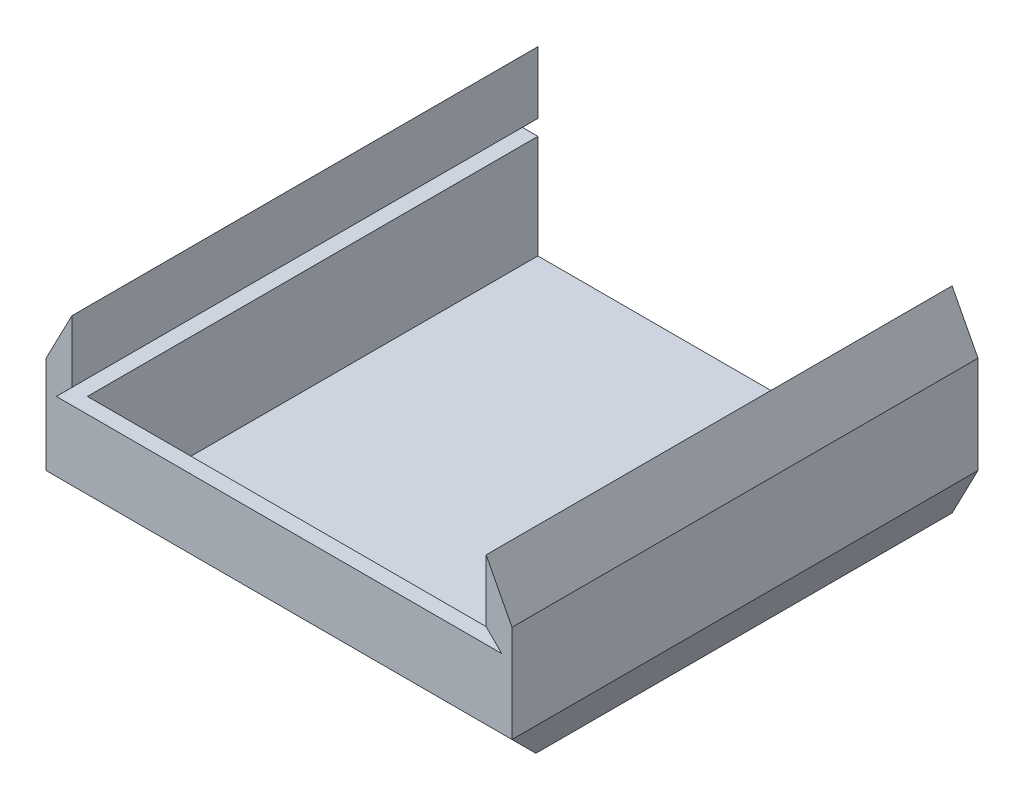
ISO-10303-21;
HEADER;
FILE_DESCRIPTION(('STEP AP214'),'2;1');
FILE_NAME('part.step','',(''),(''),'','','');
FILE_SCHEMA(('AUTOMOTIVE_DESIGN { 1 0 10303 214 1 1 1 1 }'));
ENDSEC;
DATA;
#1=APPLICATION_CONTEXT('core data for automotive mechanical design processes');
#2=APPLICATION_PROTOCOL_DEFINITION('international standard','automotive_design',2000,#1);
#3=PRODUCT_CONTEXT('',#1,'mechanical');
#4=PRODUCT('Part','Part','',(#3));
#5=PRODUCT_RELATED_PRODUCT_CATEGORY('part','',(#4));
#6=PRODUCT_DEFINITION_FORMATION('','',#4);
#7=PRODUCT_DEFINITION_CONTEXT('part definition',#1,'design');
#8=PRODUCT_DEFINITION('design','',#6,#7);
#9=PRODUCT_DEFINITION_SHAPE('','',#8);
#10=(LENGTH_UNIT() NAMED_UNIT(*) SI_UNIT(.MILLI.,.METRE.));
#11=(NAMED_UNIT(*) PLANE_ANGLE_UNIT() SI_UNIT($,.RADIAN.));
#12=(NAMED_UNIT(*) SI_UNIT($,.STERADIAN.) SOLID_ANGLE_UNIT());
#13=UNCERTAINTY_MEASURE_WITH_UNIT(LENGTH_MEASURE(1.E-05),#10,'distance_accuracy_value','');
#14=(GEOMETRIC_REPRESENTATION_CONTEXT(3) GLOBAL_UNCERTAINTY_ASSIGNED_CONTEXT((#13)) GLOBAL_UNIT_ASSIGNED_CONTEXT((#10,
#11,#12)) REPRESENTATION_CONTEXT('',''));
#15=CARTESIAN_POINT('',(0.,0.,0.));
#16=DIRECTION('',(0.,0.,1.));
#17=DIRECTION('',(1.,0.,0.));
#18=AXIS2_PLACEMENT_3D('',#15,#16,#17);
#19=CARTESIAN_POINT('',(0.,38.,-90.));
#20=DIRECTION('',(1.,0.,0.));
#21=DIRECTION('',(0.,1.,0.));
#22=AXIS2_PLACEMENT_3D('',#19,#20,#21);
#23=PLANE('',#22);
#24=DIRECTION('',(0.,-1.,0.));
#25=VECTOR('',#24,1.);
#26=CARTESIAN_POINT('',(0.,23.,-3.));
#27=LINE('',#26,#25);
#28=CARTESIAN_POINT('',(0.,23.,-3.00000000000003));
#29=VERTEX_POINT('',#28);
#30=CARTESIAN_POINT('',(0.,7.99999999999998,-3.));
#31=VERTEX_POINT('',#30);
#32=EDGE_CURVE('E324',#29,#31,#27,.T.);
#33=ORIENTED_EDGE('',*,*,#32,.T.);
#34=DIRECTION('',(0.,0.707106781186545,0.70710678118655));
#35=VECTOR('',#34,1.);
#36=CARTESIAN_POINT('',(0.,-20.5000000000001,-31.5000000000003));
#37=LINE('',#36,#35);
#38=CARTESIAN_POINT('',(0.,3.,-8.00000000000001));
#39=VERTEX_POINT('',#38);
#40=EDGE_CURVE('E11',#31,#39,#37,.F.);
#41=ORIENTED_EDGE('',*,*,#40,.T.);
#42=DIRECTION('',(0.,0.,1.));
#43=VECTOR('',#42,1.);
#44=CARTESIAN_POINT('',(0.,3.,0.));
#45=LINE('',#44,#43);
#46=CARTESIAN_POINT('',(0.,3.,-90.));
#47=VERTEX_POINT('',#46);
#48=EDGE_CURVE('E179',#47,#39,#45,.T.);
#49=ORIENTED_EDGE('',*,*,#48,.F.);
#50=DIRECTION('',(0.,1.,0.));
#51=VECTOR('',#50,1.);
#52=CARTESIAN_POINT('',(0.,38.,-90.));
#53=LINE('',#52,#51);
#54=CARTESIAN_POINT('',(0.,23.,-90.));
#55=VERTEX_POINT('',#54);
#56=EDGE_CURVE('E173',#47,#55,#53,.T.);
#57=ORIENTED_EDGE('',*,*,#56,.T.);
#58=DIRECTION('',(0.,0.,1.));
#59=VECTOR('',#58,1.);
#60=CARTESIAN_POINT('',(0.,23.,-90.));
#61=LINE('',#60,#59);
#62=EDGE_CURVE('E156',#55,#29,#61,.T.);
#63=ORIENTED_EDGE('',*,*,#62,.T.);
#64=EDGE_LOOP('',(#33,#41,#49,#57,#63));
#65=FACE_BOUND('',#64,.T.);
#66=ADVANCED_FACE('F32',(#65),#23,.T.);
#67=CARTESIAN_POINT('',(0.,3.,0.));
#68=DIRECTION('',(0.,-1.,0.));
#69=DIRECTION('',(0.,0.,-1.));
#70=AXIS2_PLACEMENT_3D('',#67,#68,#69);
#71=PLANE('',#70);
#72=ORIENTED_EDGE('',*,*,#48,.T.);
#73=DIRECTION('',(1.,0.,0.));
#74=VECTOR('',#73,1.);
#75=CARTESIAN_POINT('',(80.,3.,-8.00000000000002));
#76=LINE('',#75,#74);
#77=CARTESIAN_POINT('',(80.,3.,-8.00000000000001));
#78=VERTEX_POINT('',#77);
#79=EDGE_CURVE('E235',#39,#78,#76,.T.);
#80=ORIENTED_EDGE('',*,*,#79,.T.);
#81=DIRECTION('',(0.,0.,-1.));
#82=VECTOR('',#81,1.);
#83=CARTESIAN_POINT('',(80.,3.,0.));
#84=LINE('',#83,#82);
#85=CARTESIAN_POINT('',(80.,3.,-90.));
#86=VERTEX_POINT('',#85);
#87=EDGE_CURVE('E211',#78,#86,#84,.T.);
#88=ORIENTED_EDGE('',*,*,#87,.T.);
#89=DIRECTION('',(-1.,0.,0.));
#90=VECTOR('',#89,1.);
#91=CARTESIAN_POINT('',(0.,3.,-90.));
#92=LINE('',#91,#90);
#93=EDGE_CURVE('E214',#86,#47,#92,.T.);
#94=ORIENTED_EDGE('',*,*,#93,.T.);
#95=EDGE_LOOP('',(#72,#80,#88,#94));
#96=FACE_BOUND('',#95,.T.);
#97=ADVANCED_FACE('F240',(#96),#71,.F.);
#98=CARTESIAN_POINT('',(80.,38.,-90.));
#99=DIRECTION('',(-1.,0.,0.));
#100=DIRECTION('',(0.,-1.,0.));
#101=AXIS2_PLACEMENT_3D('',#98,#99,#100);
#102=PLANE('',#101);
#103=ORIENTED_EDGE('',*,*,#87,.F.);
#104=DIRECTION('',(0.,-0.707106781186545,-0.70710678118655));
#105=VECTOR('',#104,1.);
#106=CARTESIAN_POINT('',(80.,-20.5000000000001,-31.5000000000004));
#107=LINE('',#106,#105);
#108=CARTESIAN_POINT('',(80.,7.99999999999998,-3.));
#109=VERTEX_POINT('',#108);
#110=EDGE_CURVE('E54',#78,#109,#107,.F.);
#111=ORIENTED_EDGE('',*,*,#110,.T.);
#112=DIRECTION('',(0.,1.,0.));
#113=VECTOR('',#112,1.);
#114=CARTESIAN_POINT('',(80.,23.,-3.));
#115=LINE('',#114,#113);
#116=CARTESIAN_POINT('',(80.,23.,-3.00000000000003));
#117=VERTEX_POINT('',#116);
#118=EDGE_CURVE('E322',#109,#117,#115,.T.);
#119=ORIENTED_EDGE('',*,*,#118,.T.);
#120=DIRECTION('',(0.,0.,1.));
#121=VECTOR('',#120,1.);
#122=CARTESIAN_POINT('',(80.,23.,-90.));
#123=LINE('',#122,#121);
#124=CARTESIAN_POINT('',(80.,23.,-90.));
#125=VERTEX_POINT('',#124);
#126=EDGE_CURVE('E248',#125,#117,#123,.T.);
#127=ORIENTED_EDGE('',*,*,#126,.F.);
#128=DIRECTION('',(0.,-1.,0.));
#129=VECTOR('',#128,1.);
#130=CARTESIAN_POINT('',(80.,38.,-90.));
#131=LINE('',#130,#129);
#132=EDGE_CURVE('E247',#125,#86,#131,.T.);
#133=ORIENTED_EDGE('',*,*,#132,.T.);
#134=EDGE_LOOP('',(#103,#111,#119,#127,#133));
#135=FACE_BOUND('',#134,.T.);
#136=ADVANCED_FACE('F244',(#135),#102,.T.);
#137=DIRECTION('',(0.,0.,1.));
#138=VECTOR('',#137,1.);
#139=CARTESIAN_POINT('',(80.,26.,-90.));
#140=LINE('',#139,#138);
#141=CARTESIAN_POINT('',(80.,26.,-90.));
#142=VERTEX_POINT('',#141);
#143=CARTESIAN_POINT('',(80.,26.,0.));
#144=VERTEX_POINT('',#143);
#145=EDGE_CURVE('E305',#142,#144,#140,.T.);
#146=ORIENTED_EDGE('',*,*,#145,.T.);
#147=DIRECTION('',(0.,-1.,0.));
#148=VECTOR('',#147,1.);
#149=CARTESIAN_POINT('',(80.,38.,0.));
#150=LINE('',#149,#148);
#151=CARTESIAN_POINT('',(80.,38.,0.));
#152=VERTEX_POINT('',#151);
#153=EDGE_CURVE('E266',#152,#144,#150,.T.);
#154=ORIENTED_EDGE('',*,*,#153,.F.);
#155=DIRECTION('',(0.,0.,1.));
#156=VECTOR('',#155,1.);
#157=CARTESIAN_POINT('',(80.,38.,-90.));
#158=LINE('',#157,#156);
#159=CARTESIAN_POINT('',(80.,38.,-90.));
#160=VERTEX_POINT('',#159);
#161=EDGE_CURVE('E196',#160,#152,#158,.T.);
#162=ORIENTED_EDGE('',*,*,#161,.F.);
#163=EDGE_CURVE('E250',#160,#142,#131,.T.);
#164=ORIENTED_EDGE('',*,*,#163,.T.);
#165=EDGE_LOOP('',(#146,#154,#162,#164));
#166=FACE_BOUND('',#165,.T.);
#167=ADVANCED_FACE('F368',(#166),#102,.T.);
#168=CARTESIAN_POINT('',(0.,3.,0.));
#169=DIRECTION('',(0.,0.,-1.));
#170=DIRECTION('',(-1.,0.,0.));
#171=AXIS2_PLACEMENT_3D('',#168,#169,#170);
#172=PLANE('',#171);
#173=DIRECTION('',(0.,-1.,0.));
#174=VECTOR('',#173,1.);
#175=CARTESIAN_POINT('',(-5.,9.60906334512409,0.));
#176=LINE('',#175,#174);
#177=CARTESIAN_POINT('',(-5.,28.3909366548759,0.));
#178=VERTEX_POINT('',#177);
#179=CARTESIAN_POINT('',(-5.,9.60999999999999,0.));
#180=VERTEX_POINT('',#179);
#181=EDGE_CURVE('E199',#178,#180,#176,.T.);
#182=ORIENTED_EDGE('',*,*,#181,.T.);
#183=DIRECTION('',(1.,0.,0.));
#184=VECTOR('',#183,1.);
#185=CARTESIAN_POINT('',(80.,9.60999999999999,0.));
#186=LINE('',#185,#184);
#187=CARTESIAN_POINT('',(85.,9.60999999999999,0.));
#188=VERTEX_POINT('',#187);
#189=EDGE_CURVE('E216',#180,#188,#186,.T.);
#190=ORIENTED_EDGE('',*,*,#189,.T.);
#191=DIRECTION('',(0.,1.,0.));
#192=VECTOR('',#191,1.);
#193=CARTESIAN_POINT('',(85.,9.60906334512409,0.));
#194=LINE('',#193,#192);
#195=CARTESIAN_POINT('',(85.,28.3909366548759,0.));
#196=VERTEX_POINT('',#195);
#197=EDGE_CURVE('E260',#188,#196,#194,.T.);
#198=ORIENTED_EDGE('',*,*,#197,.T.);
#199=DIRECTION('',(-0.461591586339288,0.887092558542106,0.));
#200=VECTOR('',#199,1.);
#201=CARTESIAN_POINT('',(85.,28.3909366548759,0.));
#202=LINE('',#201,#200);
#203=EDGE_CURVE('E262',#196,#152,#202,.T.);
#204=ORIENTED_EDGE('',*,*,#203,.T.);
#205=ORIENTED_EDGE('',*,*,#153,.T.);
#206=DIRECTION('',(-0.707106781186548,0.707106781186547,0.));
#207=VECTOR('',#206,1.);
#208=CARTESIAN_POINT('',(83.,23.,0.));
#209=LINE('',#208,#207);
#210=CARTESIAN_POINT('',(83.,23.,0.));
#211=VERTEX_POINT('',#210);
#212=EDGE_CURVE('E309',#211,#144,#209,.T.);
#213=ORIENTED_EDGE('',*,*,#212,.F.);
#214=DIRECTION('',(1.,0.,0.));
#215=VECTOR('',#214,1.);
#216=CARTESIAN_POINT('',(0.,23.,0.));
#217=LINE('',#216,#215);
#218=CARTESIAN_POINT('',(-3.,23.,0.));
#219=VERTEX_POINT('',#218);
#220=EDGE_CURVE('E308',#219,#211,#217,.T.);
#221=ORIENTED_EDGE('',*,*,#220,.F.);
#222=DIRECTION('',(-0.707106781186548,-0.707106781186547,0.));
#223=VECTOR('',#222,1.);
#224=CARTESIAN_POINT('',(-3.,23.,0.));
#225=LINE('',#224,#223);
#226=CARTESIAN_POINT('',(0.,26.,0.));
#227=VERTEX_POINT('',#226);
#228=EDGE_CURVE('E176',#227,#219,#225,.T.);
#229=ORIENTED_EDGE('',*,*,#228,.F.);
#230=DIRECTION('',(0.,1.,0.));
#231=VECTOR('',#230,1.);
#232=CARTESIAN_POINT('',(0.,38.,0.));
#233=LINE('',#232,#231);
#234=CARTESIAN_POINT('',(0.,38.,0.));
#235=VERTEX_POINT('',#234);
#236=EDGE_CURVE('E193',#227,#235,#233,.T.);
#237=ORIENTED_EDGE('',*,*,#236,.T.);
#238=DIRECTION('',(-0.461591586339287,-0.887092558542106,0.));
#239=VECTOR('',#238,1.);
#240=CARTESIAN_POINT('',(-5.,28.3909366548759,0.));
#241=LINE('',#240,#239);
#242=EDGE_CURVE('E195',#235,#178,#241,.T.);
#243=ORIENTED_EDGE('',*,*,#242,.T.);
#244=EDGE_LOOP('',(#182,#190,#198,#204,#205,#213,#221,#229,#237,#243));
#245=FACE_BOUND('',#244,.T.);
#246=ADVANCED_FACE('F358',(#245),#172,.F.);
#247=CARTESIAN_POINT('',(0.,3.,-90.));
#248=DIRECTION('',(0.,0.,1.));
#249=DIRECTION('',(1.,0.,0.));
#250=AXIS2_PLACEMENT_3D('',#247,#248,#249);
#251=PLANE('',#250);
#252=DIRECTION('',(-0.707106781186548,-0.707106781186547,0.));
#253=VECTOR('',#252,1.);
#254=CARTESIAN_POINT('',(-3.,23.,-90.));
#255=LINE('',#254,#253);
#256=CARTESIAN_POINT('',(0.,26.,-90.));
#257=VERTEX_POINT('',#256);
#258=CARTESIAN_POINT('',(-3.,23.,-90.));
#259=VERTEX_POINT('',#258);
#260=EDGE_CURVE('E167',#257,#259,#255,.T.);
#261=ORIENTED_EDGE('',*,*,#260,.T.);
#262=DIRECTION('',(1.,0.,0.));
#263=VECTOR('',#262,1.);
#264=CARTESIAN_POINT('',(0.,23.,-90.));
#265=LINE('',#264,#263);
#266=EDGE_CURVE('E159',#259,#55,#265,.T.);
#267=ORIENTED_EDGE('',*,*,#266,.T.);
#268=ORIENTED_EDGE('',*,*,#56,.F.);
#269=ORIENTED_EDGE('',*,*,#93,.F.);
#270=ORIENTED_EDGE('',*,*,#132,.F.);
#271=DIRECTION('',(1.,0.,0.));
#272=VECTOR('',#271,1.);
#273=CARTESIAN_POINT('',(80.,23.,-90.));
#274=LINE('',#273,#272);
#275=CARTESIAN_POINT('',(83.,23.,-90.));
#276=VERTEX_POINT('',#275);
#277=EDGE_CURVE('E311',#125,#276,#274,.T.);
#278=ORIENTED_EDGE('',*,*,#277,.T.);
#279=DIRECTION('',(-0.707106781186548,0.707106781186547,0.));
#280=VECTOR('',#279,1.);
#281=CARTESIAN_POINT('',(83.,23.,-90.));
#282=LINE('',#281,#280);
#283=EDGE_CURVE('E302',#276,#142,#282,.T.);
#284=ORIENTED_EDGE('',*,*,#283,.T.);
#285=ORIENTED_EDGE('',*,*,#163,.F.);
#286=DIRECTION('',(-0.461591586339288,0.887092558542106,0.));
#287=VECTOR('',#286,1.);
#288=CARTESIAN_POINT('',(85.,28.3909366548759,-90.));
#289=LINE('',#288,#287);
#290=CARTESIAN_POINT('',(85.,28.3909366548759,-90.));
#291=VERTEX_POINT('',#290);
#292=EDGE_CURVE('E251',#291,#160,#289,.T.);
#293=ORIENTED_EDGE('',*,*,#292,.F.);
#294=DIRECTION('',(0.,1.,0.));
#295=VECTOR('',#294,1.);
#296=CARTESIAN_POINT('',(85.,9.60906334512409,-90.));
#297=LINE('',#296,#295);
#298=CARTESIAN_POINT('',(85.,9.60906334512409,-90.));
#299=VERTEX_POINT('',#298);
#300=EDGE_CURVE('E256',#299,#291,#297,.T.);
#301=ORIENTED_EDGE('',*,*,#300,.F.);
#302=DIRECTION('',(0.461591586339288,0.887092558542106,0.));
#303=VECTOR('',#302,1.);
#304=CARTESIAN_POINT('',(80.,0.,-90.));
#305=LINE('',#304,#303);
#306=CARTESIAN_POINT('',(80.,0.,-90.));
#307=VERTEX_POINT('',#306);
#308=EDGE_CURVE('E269',#307,#299,#305,.T.);
#309=ORIENTED_EDGE('',*,*,#308,.F.);
#310=DIRECTION('',(-1.,0.,0.));
#311=VECTOR('',#310,1.);
#312=CARTESIAN_POINT('',(0.,0.,-90.));
#313=LINE('',#312,#311);
#314=CARTESIAN_POINT('',(0.,0.,-90.));
#315=VERTEX_POINT('',#314);
#316=EDGE_CURVE('E212',#307,#315,#313,.T.);
#317=ORIENTED_EDGE('',*,*,#316,.T.);
#318=DIRECTION('',(0.461591586339287,-0.887092558542106,0.));
#319=VECTOR('',#318,1.);
#320=CARTESIAN_POINT('',(0.,0.,-90.));
#321=LINE('',#320,#319);
#322=CARTESIAN_POINT('',(-5.,9.60906334512409,-90.));
#323=VERTEX_POINT('',#322);
#324=EDGE_CURVE('E186',#323,#315,#321,.T.);
#325=ORIENTED_EDGE('',*,*,#324,.F.);
#326=DIRECTION('',(0.,-1.,0.));
#327=VECTOR('',#326,1.);
#328=CARTESIAN_POINT('',(-5.,9.60906334512409,-90.));
#329=LINE('',#328,#327);
#330=CARTESIAN_POINT('',(-5.,28.3909366548759,-90.));
#331=VERTEX_POINT('',#330);
#332=EDGE_CURVE('E184',#331,#323,#329,.T.);
#333=ORIENTED_EDGE('',*,*,#332,.F.);
#334=DIRECTION('',(-0.461591586339287,-0.887092558542106,0.));
#335=VECTOR('',#334,1.);
#336=CARTESIAN_POINT('',(-5.,28.3909366548759,-90.));
#337=LINE('',#336,#335);
#338=CARTESIAN_POINT('',(0.,38.,-90.));
#339=VERTEX_POINT('',#338);
#340=EDGE_CURVE('E180',#339,#331,#337,.T.);
#341=ORIENTED_EDGE('',*,*,#340,.F.);
#342=EDGE_CURVE('E181',#257,#339,#53,.T.);
#343=ORIENTED_EDGE('',*,*,#342,.F.);
#344=EDGE_LOOP('',(#261,#267,#268,#269,#270,#278,#284,#285,#293,#301,#309,#317,#325,#333,#341,#343));
#345=FACE_BOUND('',#344,.T.);
#346=ADVANCED_FACE('F171',(#345),#251,.F.);
#347=CARTESIAN_POINT('',(0.,0.,0.));
#348=DIRECTION('',(0.,-1.,0.));
#349=DIRECTION('',(0.,0.,-1.));
#350=AXIS2_PLACEMENT_3D('',#347,#348,#349);
#351=PLANE('',#350);
#352=DIRECTION('',(0.,0.,-1.));
#353=VECTOR('',#352,1.);
#354=CARTESIAN_POINT('',(80.,0.,0.));
#355=LINE('',#354,#353);
#356=CARTESIAN_POINT('',(80.,0.,-9.61000000000003));
#357=VERTEX_POINT('',#356);
#358=EDGE_CURVE('E219',#357,#307,#355,.T.);
#359=ORIENTED_EDGE('',*,*,#358,.F.);
#360=DIRECTION('',(-1.,0.,0.));
#361=VECTOR('',#360,1.);
#362=CARTESIAN_POINT('',(0.,0.,-9.61000000000004));
#363=LINE('',#362,#361);
#364=CARTESIAN_POINT('',(0.,0.,-9.61000000000003));
#365=VERTEX_POINT('',#364);
#366=EDGE_CURVE('E229',#357,#365,#363,.T.);
#367=ORIENTED_EDGE('',*,*,#366,.T.);
#368=DIRECTION('',(0.,0.,1.));
#369=VECTOR('',#368,1.);
#370=CARTESIAN_POINT('',(0.,0.,0.));
#371=LINE('',#370,#369);
#372=EDGE_CURVE('E205',#315,#365,#371,.T.);
#373=ORIENTED_EDGE('',*,*,#372,.F.);
#374=ORIENTED_EDGE('',*,*,#316,.F.);
#375=EDGE_LOOP('',(#359,#367,#373,#374));
#376=FACE_BOUND('',#375,.T.);
#377=ADVANCED_FACE('F291',(#376),#351,.T.);
#378=DIRECTION('',(0.,0.,1.));
#379=VECTOR('',#378,1.);
#380=CARTESIAN_POINT('',(0.,26.,-90.));
#381=LINE('',#380,#379);
#382=EDGE_CURVE('E166',#257,#227,#381,.T.);
#383=ORIENTED_EDGE('',*,*,#382,.F.);
#384=ORIENTED_EDGE('',*,*,#342,.T.);
#385=DIRECTION('',(0.,0.,1.));
#386=VECTOR('',#385,1.);
#387=CARTESIAN_POINT('',(0.,38.,-90.));
#388=LINE('',#387,#386);
#389=EDGE_CURVE('E192',#339,#235,#388,.T.);
#390=ORIENTED_EDGE('',*,*,#389,.T.);
#391=ORIENTED_EDGE('',*,*,#236,.F.);
#392=EDGE_LOOP('',(#383,#384,#390,#391));
#393=FACE_BOUND('',#392,.T.);
#394=ADVANCED_FACE('F332',(#393),#23,.T.);
#395=CARTESIAN_POINT('',(0.,0.,-90.));
#396=DIRECTION('',(-0.887092558542106,-0.461591586339287,0.));
#397=DIRECTION('',(0.461591586339287,-0.887092558542106,0.));
#398=AXIS2_PLACEMENT_3D('',#395,#396,#397);
#399=PLANE('',#398);
#400=ORIENTED_EDGE('',*,*,#372,.T.);
#401=DIRECTION('',(-0.345305681678899,0.663612833736761,0.663612833736763));
#402=VECTOR('',#401,1.);
#403=CARTESIAN_POINT('',(18.4213107738976,-35.4023084253199,-45.01230842532));
#404=LINE('',#403,#402);
#405=CARTESIAN_POINT('',(-5.,9.60906334512409,-0.000936654875924314));
#406=VERTEX_POINT('',#405);
#407=EDGE_CURVE('E231',#365,#406,#404,.T.);
#408=ORIENTED_EDGE('',*,*,#407,.T.);
#409=DIRECTION('',(0.,0.,1.));
#410=VECTOR('',#409,1.);
#411=CARTESIAN_POINT('',(-5.,9.60906334512409,-90.));
#412=LINE('',#411,#410);
#413=EDGE_CURVE('E202',#323,#406,#412,.T.);
#414=ORIENTED_EDGE('',*,*,#413,.F.);
#415=ORIENTED_EDGE('',*,*,#324,.T.);
#416=EDGE_LOOP('',(#400,#408,#414,#415));
#417=FACE_BOUND('',#416,.T.);
#418=ADVANCED_FACE('F294',(#417),#399,.T.);
#419=CARTESIAN_POINT('',(-5.,9.60906334512409,-90.));
#420=DIRECTION('',(-1.,0.,0.));
#421=DIRECTION('',(0.,-1.,0.));
#422=AXIS2_PLACEMENT_3D('',#419,#420,#421);
#423=PLANE('',#422);
#424=ORIENTED_EDGE('',*,*,#413,.T.);
#425=DIRECTION('',(0.,0.707106781186546,0.707106781186549));
#426=VECTOR('',#425,1.);
#427=CARTESIAN_POINT('',(-4.99999999999999,-35.390468327438,-45.0004683274381));
#428=LINE('',#427,#426);
#429=EDGE_CURVE('E233',#406,#180,#428,.T.);
#430=ORIENTED_EDGE('',*,*,#429,.T.);
#431=ORIENTED_EDGE('',*,*,#181,.F.);
#432=DIRECTION('',(0.,0.,1.));
#433=VECTOR('',#432,1.);
#434=CARTESIAN_POINT('',(-5.,28.3909366548759,-90.));
#435=LINE('',#434,#433);
#436=EDGE_CURVE('E206',#331,#178,#435,.T.);
#437=ORIENTED_EDGE('',*,*,#436,.F.);
#438=ORIENTED_EDGE('',*,*,#332,.T.);
#439=EDGE_LOOP('',(#424,#430,#431,#437,#438));
#440=FACE_BOUND('',#439,.T.);
#441=ADVANCED_FACE('F345',(#440),#423,.T.);
#442=CARTESIAN_POINT('',(-5.,28.3909366548759,-90.));
#443=DIRECTION('',(-0.887092558542106,0.461591586339287,0.));
#444=DIRECTION('',(-0.461591586339287,-0.887092558542106,0.));
#445=AXIS2_PLACEMENT_3D('',#442,#443,#444);
#446=PLANE('',#445);
#447=ORIENTED_EDGE('',*,*,#242,.F.);
#448=ORIENTED_EDGE('',*,*,#389,.F.);
#449=ORIENTED_EDGE('',*,*,#340,.T.);
#450=ORIENTED_EDGE('',*,*,#436,.T.);
#451=EDGE_LOOP('',(#447,#448,#449,#450));
#452=FACE_BOUND('',#451,.T.);
#453=ADVANCED_FACE('F355',(#452),#446,.T.);
#454=CARTESIAN_POINT('',(80.,0.,-90.));
#455=DIRECTION('',(0.887092558542106,-0.461591586339288,0.));
#456=DIRECTION('',(0.461591586339288,0.887092558542106,0.));
#457=AXIS2_PLACEMENT_3D('',#454,#455,#456);
#458=PLANE('',#457);
#459=DIRECTION('',(0.,0.,1.));
#460=VECTOR('',#459,1.);
#461=CARTESIAN_POINT('',(85.,9.60906334512409,-90.));
#462=LINE('',#461,#460);
#463=CARTESIAN_POINT('',(85.,9.60906334512409,-0.000936654875924314));
#464=VERTEX_POINT('',#463);
#465=EDGE_CURVE('E254',#299,#464,#462,.T.);
#466=ORIENTED_EDGE('',*,*,#465,.T.);
#467=DIRECTION('',(-0.3453056816789,-0.66361283373676,-0.663612833736763));
#468=VECTOR('',#467,1.);
#469=CARTESIAN_POINT('',(61.5786892261023,-35.4023084253198,-45.01230842532));
#470=LINE('',#469,#468);
#471=EDGE_CURVE('E227',#464,#357,#470,.T.);
#472=ORIENTED_EDGE('',*,*,#471,.T.);
#473=ORIENTED_EDGE('',*,*,#358,.T.);
#474=ORIENTED_EDGE('',*,*,#308,.T.);
#475=EDGE_LOOP('',(#466,#472,#473,#474));
#476=FACE_BOUND('',#475,.T.);
#477=ADVANCED_FACE('F277',(#476),#458,.T.);
#478=CARTESIAN_POINT('',(85.,28.3909366548759,-90.));
#479=DIRECTION('',(0.887092558542106,0.461591586339288,0.));
#480=DIRECTION('',(-0.461591586339288,0.887092558542106,0.));
#481=AXIS2_PLACEMENT_3D('',#478,#479,#480);
#482=PLANE('',#481);
#483=ORIENTED_EDGE('',*,*,#203,.F.);
#484=DIRECTION('',(0.,0.,1.));
#485=VECTOR('',#484,1.);
#486=CARTESIAN_POINT('',(85.,28.3909366548759,-90.));
#487=LINE('',#486,#485);
#488=EDGE_CURVE('E271',#291,#196,#487,.T.);
#489=ORIENTED_EDGE('',*,*,#488,.F.);
#490=ORIENTED_EDGE('',*,*,#292,.T.);
#491=ORIENTED_EDGE('',*,*,#161,.T.);
#492=EDGE_LOOP('',(#483,#489,#490,#491));
#493=FACE_BOUND('',#492,.T.);
#494=ADVANCED_FACE('F364',(#493),#482,.T.);
#495=CARTESIAN_POINT('',(85.,9.60906334512409,-90.));
#496=DIRECTION('',(1.,0.,0.));
#497=DIRECTION('',(0.,1.,0.));
#498=AXIS2_PLACEMENT_3D('',#495,#496,#497);
#499=PLANE('',#498);
#500=ORIENTED_EDGE('',*,*,#197,.F.);
#501=DIRECTION('',(0.,-0.707106781186546,-0.707106781186549));
#502=VECTOR('',#501,1.);
#503=CARTESIAN_POINT('',(85.,-35.390468327438,-45.0004683274381));
#504=LINE('',#503,#502);
#505=EDGE_CURVE('E225',#188,#464,#504,.T.);
#506=ORIENTED_EDGE('',*,*,#505,.T.);
#507=ORIENTED_EDGE('',*,*,#465,.F.);
#508=ORIENTED_EDGE('',*,*,#300,.T.);
#509=ORIENTED_EDGE('',*,*,#488,.T.);
#510=EDGE_LOOP('',(#500,#506,#507,#508,#509));
#511=FACE_BOUND('',#510,.T.);
#512=ADVANCED_FACE('F361',(#511),#499,.T.);
#513=CARTESIAN_POINT('',(83.,23.,-90.));
#514=DIRECTION('',(0.707106781186547,0.707106781186548,0.));
#515=DIRECTION('',(-0.707106781186548,0.707106781186547,0.));
#516=AXIS2_PLACEMENT_3D('',#513,#514,#515);
#517=PLANE('',#516);
#518=ORIENTED_EDGE('',*,*,#212,.T.);
#519=ORIENTED_EDGE('',*,*,#145,.F.);
#520=ORIENTED_EDGE('',*,*,#283,.F.);
#521=DIRECTION('',(0.,0.,1.));
#522=VECTOR('',#521,1.);
#523=CARTESIAN_POINT('',(83.,23.,-90.));
#524=LINE('',#523,#522);
#525=EDGE_CURVE('E301',#276,#211,#524,.T.);
#526=ORIENTED_EDGE('',*,*,#525,.T.);
#527=EDGE_LOOP('',(#518,#519,#520,#526));
#528=FACE_BOUND('',#527,.T.);
#529=ADVANCED_FACE('F372',(#528),#517,.F.);
#530=CARTESIAN_POINT('',(0.,23.,-90.));
#531=DIRECTION('',(0.,-1.,0.));
#532=DIRECTION('',(0.,0.,-1.));
#533=AXIS2_PLACEMENT_3D('',#530,#531,#532);
#534=PLANE('',#533);
#535=ORIENTED_EDGE('',*,*,#220,.T.);
#536=ORIENTED_EDGE('',*,*,#525,.F.);
#537=ORIENTED_EDGE('',*,*,#277,.F.);
#538=ORIENTED_EDGE('',*,*,#126,.T.);
#539=DIRECTION('',(-1.,0.,0.));
#540=VECTOR('',#539,1.);
#541=CARTESIAN_POINT('',(0.,23.,-3.));
#542=LINE('',#541,#540);
#543=EDGE_CURVE('E163',#117,#29,#542,.T.);
#544=ORIENTED_EDGE('',*,*,#543,.T.);
#545=ORIENTED_EDGE('',*,*,#62,.F.);
#546=ORIENTED_EDGE('',*,*,#266,.F.);
#547=DIRECTION('',(0.,0.,1.));
#548=VECTOR('',#547,1.);
#549=CARTESIAN_POINT('',(-3.,23.,-90.));
#550=LINE('',#549,#548);
#551=EDGE_CURVE('E263',#259,#219,#550,.T.);
#552=ORIENTED_EDGE('',*,*,#551,.T.);
#553=EDGE_LOOP('',(#535,#536,#537,#538,#544,#545,#546,#552));
#554=FACE_BOUND('',#553,.T.);
#555=ADVANCED_FACE('F158',(#554),#534,.F.);
#556=CARTESIAN_POINT('',(-3.,23.,-90.));
#557=DIRECTION('',(-0.707106781186547,0.707106781186548,0.));
#558=DIRECTION('',(-0.707106781186548,-0.707106781186547,0.));
#559=AXIS2_PLACEMENT_3D('',#556,#557,#558);
#560=PLANE('',#559);
#561=ORIENTED_EDGE('',*,*,#228,.T.);
#562=ORIENTED_EDGE('',*,*,#551,.F.);
#563=ORIENTED_EDGE('',*,*,#260,.F.);
#564=ORIENTED_EDGE('',*,*,#382,.T.);
#565=EDGE_LOOP('',(#561,#562,#563,#564));
#566=FACE_BOUND('',#565,.T.);
#567=ADVANCED_FACE('F374',(#566),#560,.F.);
#568=CARTESIAN_POINT('',(0.,0.,-3.));
#569=DIRECTION('',(0.,0.,1.));
#570=DIRECTION('',(1.,0.,0.));
#571=AXIS2_PLACEMENT_3D('',#568,#569,#570);
#572=PLANE('',#571);
#573=ORIENTED_EDGE('',*,*,#118,.F.);
#574=DIRECTION('',(-1.,0.,0.));
#575=VECTOR('',#574,1.);
#576=CARTESIAN_POINT('',(0.,7.99999999999998,-3.));
#577=LINE('',#576,#575);
#578=EDGE_CURVE('E40',#109,#31,#577,.T.);
#579=ORIENTED_EDGE('',*,*,#578,.T.);
#580=ORIENTED_EDGE('',*,*,#32,.F.);
#581=ORIENTED_EDGE('',*,*,#543,.F.);
#582=EDGE_LOOP('',(#573,#579,#580,#581));
#583=FACE_BOUND('',#582,.T.);
#584=ADVANCED_FACE('F329',(#583),#572,.F.);
#585=CARTESIAN_POINT('',(0.,9.60999999999999,0.));
#586=DIRECTION('',(0.,-0.707106781186549,0.707106781186546));
#587=DIRECTION('',(-1.,0.,0.));
#588=AXIS2_PLACEMENT_3D('',#585,#586,#587);
#589=PLANE('',#588);
#590=ORIENTED_EDGE('',*,*,#407,.F.);
#591=ORIENTED_EDGE('',*,*,#366,.F.);
#592=ORIENTED_EDGE('',*,*,#471,.F.);
#593=ORIENTED_EDGE('',*,*,#505,.F.);
#594=ORIENTED_EDGE('',*,*,#189,.F.);
#595=ORIENTED_EDGE('',*,*,#429,.F.);
#596=EDGE_LOOP('',(#590,#591,#592,#593,#594,#595));
#597=FACE_BOUND('',#596,.T.);
#598=ADVANCED_FACE('F286',(#597),#589,.T.);
#599=CARTESIAN_POINT('',(0.,3.,-8.00000000000002));
#600=DIRECTION('',(0.,0.70710678118655,-0.707106781186545));
#601=DIRECTION('',(-1.,0.,0.));
#602=AXIS2_PLACEMENT_3D('',#599,#600,#601);
#603=PLANE('',#602);
#604=ORIENTED_EDGE('',*,*,#40,.F.);
#605=ORIENTED_EDGE('',*,*,#578,.F.);
#606=ORIENTED_EDGE('',*,*,#110,.F.);
#607=ORIENTED_EDGE('',*,*,#79,.F.);
#608=EDGE_LOOP('',(#604,#605,#606,#607));
#609=FACE_BOUND('',#608,.T.);
#610=ADVANCED_FACE('F34',(#609),#603,.T.);
#611=CLOSED_SHELL('',(#66,#97,#136,#167,#246,#346,#377,#394,#418,#441,#453,#477,#494,#512,#529,
#555,#567,#584,#598,#610));
#612=MANIFOLD_SOLID_BREP('B2',#611);
#613=ADVANCED_BREP_SHAPE_REPRESENTATION('',(#18,#612),#14);
#614=SHAPE_DEFINITION_REPRESENTATION(#9,#613);
ENDSEC;
END-ISO-10303-21;
